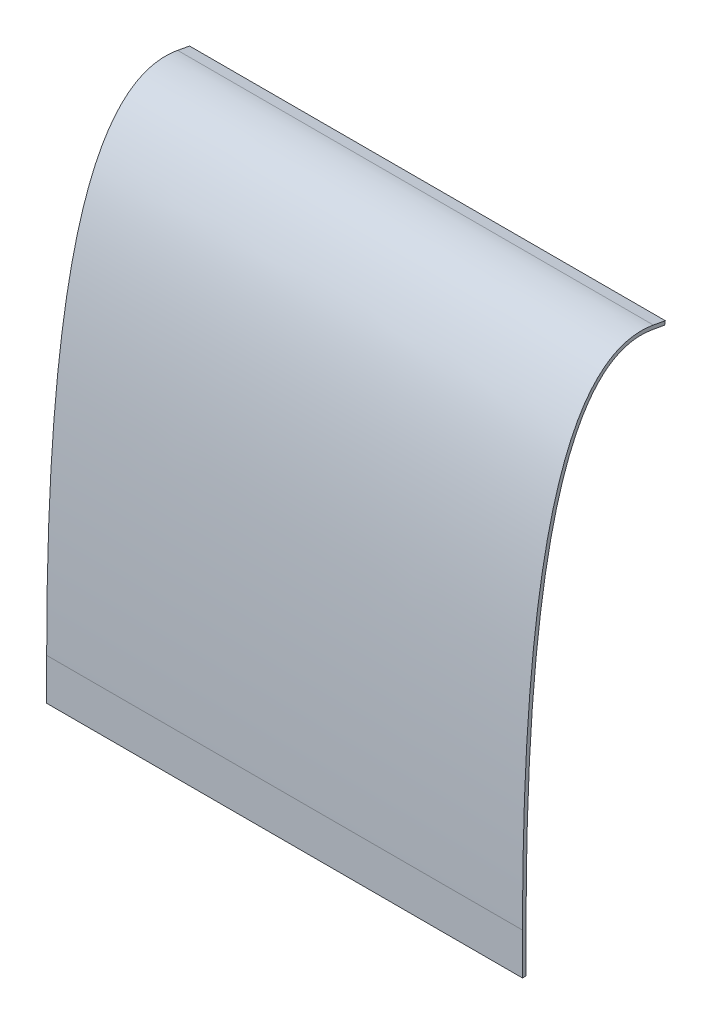
ISO-10303-21;
HEADER;
FILE_DESCRIPTION(('STEP AP214'),'2;1');
FILE_NAME('part.step','',(''),(''),'','','');
FILE_SCHEMA(('AUTOMOTIVE_DESIGN { 1 0 10303 214 1 1 1 1 }'));
ENDSEC;
DATA;
#1=APPLICATION_CONTEXT('core data for automotive mechanical design processes');
#2=APPLICATION_PROTOCOL_DEFINITION('international standard','automotive_design',2000,#1);
#3=PRODUCT_CONTEXT('',#1,'mechanical');
#4=PRODUCT('Part','Part','',(#3));
#5=PRODUCT_RELATED_PRODUCT_CATEGORY('part','',(#4));
#6=PRODUCT_DEFINITION_FORMATION('','',#4);
#7=PRODUCT_DEFINITION_CONTEXT('part definition',#1,'design');
#8=PRODUCT_DEFINITION('design','',#6,#7);
#9=PRODUCT_DEFINITION_SHAPE('','',#8);
#10=(LENGTH_UNIT() NAMED_UNIT(*) SI_UNIT(.MILLI.,.METRE.));
#11=(NAMED_UNIT(*) PLANE_ANGLE_UNIT() SI_UNIT($,.RADIAN.));
#12=(NAMED_UNIT(*) SI_UNIT($,.STERADIAN.) SOLID_ANGLE_UNIT());
#13=UNCERTAINTY_MEASURE_WITH_UNIT(LENGTH_MEASURE(1.E-05),#10,'distance_accuracy_value','');
#14=(GEOMETRIC_REPRESENTATION_CONTEXT(3) GLOBAL_UNCERTAINTY_ASSIGNED_CONTEXT((#13)) GLOBAL_UNIT_ASSIGNED_CONTEXT((#10,
#11,#12)) REPRESENTATION_CONTEXT('',''));
#15=CARTESIAN_POINT('',(0.,0.,0.));
#16=DIRECTION('',(0.,0.,1.));
#17=DIRECTION('',(1.,0.,0.));
#18=AXIS2_PLACEMENT_3D('',#15,#16,#17);
#19=CARTESIAN_POINT('',(0.,-5374.65375184319,3.175));
#20=DIRECTION('',(1.,0.,0.));
#21=DIRECTION('',(0.,1.,0.));
#22=AXIS2_PLACEMENT_3D('',#19,#20,#21);
#23=PLANE('',#22);
#24=DIRECTION('',(0.,-1.,0.));
#25=VECTOR('',#24,1.);
#26=CARTESIAN_POINT('',(0.,-5374.65375184319,0.));
#27=LINE('',#26,#25);
#28=CARTESIAN_POINT('',(0.,-5338.16883094508,-1.55431223447522E-12));
#29=VERTEX_POINT('',#28);
#30=CARTESIAN_POINT('',(0.,-5374.65375184319,0.));
#31=VERTEX_POINT('',#30);
#32=EDGE_CURVE('E95',#29,#31,#27,.T.);
#33=ORIENTED_EDGE('',*,*,#32,.T.);
#34=DIRECTION('',(0.,0.,-1.));
#35=VECTOR('',#34,1.);
#36=CARTESIAN_POINT('',(0.,-5374.65375184319,3.175));
#37=LINE('',#36,#35);
#38=CARTESIAN_POINT('',(0.,-5374.65375184319,3.175));
#39=VERTEX_POINT('',#38);
#40=EDGE_CURVE('E11',#39,#31,#37,.T.);
#41=ORIENTED_EDGE('',*,*,#40,.F.);
#42=DIRECTION('',(0.,-1.,0.));
#43=VECTOR('',#42,1.);
#44=CARTESIAN_POINT('',(0.,-5374.65375184319,3.175));
#45=LINE('',#44,#43);
#46=CARTESIAN_POINT('',(0.,-5338.16883094508,3.175));
#47=VERTEX_POINT('',#46);
#48=EDGE_CURVE('E88',#47,#39,#45,.T.);
#49=ORIENTED_EDGE('',*,*,#48,.F.);
#50=CARTESIAN_POINT('',(0.,-5338.16883094512,3.17499999999692));
#51=CARTESIAN_POINT('',(0.,-5335.98734076766,3.17499999999698));
#52=CARTESIAN_POINT('',(0.,-5331.61137520197,3.17046541118602));
#53=CARTESIAN_POINT('',(0.,-5322.96335403535,3.14325696179797));
#54=CARTESIAN_POINT('',(0.,-5312.27638574883,3.07523348434504));
#55=CARTESIAN_POINT('',(0.,-5299.67140732244,2.93917848604421));
#56=CARTESIAN_POINT('',(0.,-5283.14925353704,2.68519354127753));
#57=CARTESIAN_POINT('',(0.,-5263.03358789846,2.23160969949004));
#58=CARTESIAN_POINT('',(0.,-5239.75265206165,1.46947489329059));
#59=CARTESIAN_POINT('',(0.,-5217.32963310155,0.489420194701327));
#60=CARTESIAN_POINT('',(0.,-5188.57565879304,-1.10802295379985));
#61=CARTESIAN_POINT('',(0.,-5154.77627524637,-3.65020946173063));
#62=CARTESIAN_POINT('',(0.,-5117.64263301676,-7.57487259671049));
#63=CARTESIAN_POINT('',(0.,-5083.93016515085,-12.3759483752846));
#64=CARTESIAN_POINT('',(0.,-5053.63287456938,-18.0569483816005));
#65=CARTESIAN_POINT('',(0.,-5017.77931089873,-26.8143362972912));
#66=CARTESIAN_POINT('',(0.,-4988.71861289562,-37.3605308212314));
#67=CARTESIAN_POINT('',(0.,-4966.39885120448,-49.7957669766878));
#68=CARTESIAN_POINT('',(0.,-4953.02734383279,-60.1213480910946));
#69=CARTESIAN_POINT('',(0.,-4943.05871353346,-71.5130112879739));
#70=CARTESIAN_POINT('',(0.,-4937.68084608282,-81.9236706532682));
#71=CARTESIAN_POINT('',(0.,-4935.2065623479,-90.7533778061448));
#72=CARTESIAN_POINT('',(0.,-4934.27161001883,-97.5979563520677));
#73=CARTESIAN_POINT('',(0.,-4934.25945037581,-103.474595101765));
#74=CARTESIAN_POINT('',(0.,-4934.70154226411,-108.253920150425));
#75=CARTESIAN_POINT('',(0.,-4935.07716391724,-110.696774930857));
#76=CARTESIAN_POINT('',(0.,-4935.29808523912,-111.902729484426));
#77=B_SPLINE_CURVE_WITH_KNOTS('',3,(#50,#51,#52,#53,#54,#55,#56,#57,#58,#59,#60,#61,#62,#63,#64,
#65,#66,#67,#68,#69,#70,#71,#72,#73,#74,#75,#76),.UNSPECIFIED.,.F.,.F.,(4,1,1,1,1,1,1,1,1,1,1,1,
1,1,1,1,1,1,1,1,1,1,1,1,4),(0.490445446996944,0.490528714033792,0.490611981070641,
0.490778515144339,0.490945049218036,0.491111583291734,0.491444651439129,0.491777719586524,
0.492110787733919,0.492443855881315,0.493109992176105,0.493776128470895,0.494442264765686,
0.495108401060476,0.495774537355266,0.497106809944847,0.497772946239638,0.498439082534428,
0.499105218829218,0.499771355124009,0.500104423271404,0.500437491418799,0.500770559566194,
0.500937093639892,0.501103627713589),.UNSPECIFIED.);
#78=CARTESIAN_POINT('',(0.,-4935.29808523912,-111.902729484426));
#79=VERTEX_POINT('',#78);
#80=EDGE_CURVE('E49',#47,#79,#77,.T.);
#81=ORIENTED_EDGE('',*,*,#80,.T.);
#82=DIRECTION('',(0.,-0.180193443168995,-0.983631192591462));
#83=VECTOR('',#82,1.);
#84=CARTESIAN_POINT('',(0.,-4935.29808523912,-111.902729484426));
#85=LINE('',#84,#83);
#86=CARTESIAN_POINT('',(0.,-4937.21565146267,-122.370246604773));
#87=VERTEX_POINT('',#86);
#88=EDGE_CURVE('E143',#79,#87,#85,.T.);
#89=ORIENTED_EDGE('',*,*,#88,.T.);
#90=DIRECTION('',(0.,-0.983631192592149,0.180193443165247));
#91=VECTOR('',#90,1.);
#92=CARTESIAN_POINT('',(0.,-4940.33868049915,-121.798132422724));
#93=LINE('',#92,#91);
#94=CARTESIAN_POINT('',(0.,-4940.33868049915,-121.798132422724));
#95=VERTEX_POINT('',#94);
#96=EDGE_CURVE('E134',#87,#95,#93,.T.);
#97=ORIENTED_EDGE('',*,*,#96,.T.);
#98=DIRECTION('',(0.,0.180193443165249,0.983631192592148));
#99=VECTOR('',#98,1.);
#100=CARTESIAN_POINT('',(0.,-4938.42111427564,-111.33061530237));
#101=LINE('',#100,#99);
#102=CARTESIAN_POINT('',(0.,-4938.42111427564,-111.33061530237));
#103=VERTEX_POINT('',#102);
#104=EDGE_CURVE('E126',#95,#103,#101,.T.);
#105=ORIENTED_EDGE('',*,*,#104,.T.);
#106=CARTESIAN_POINT('',(0.,-972092.39667576,-254466.035004709));
#107=CARTESIAN_POINT('',(0.,964580.96794132,244923.154052706));
#108=CARTESIAN_POINT('',(0.,-976825.222864024,-235738.14631102));
#109=B_SPLINE_CURVE_WITH_KNOTS('',2,(#106,#107,#108),.UNSPECIFIED.,.F.,.F.,(3,3),(0.,1.),.UNSPECIFIED.);
#110=EDGE_CURVE('E70',#103,#29,#109,.T.);
#111=ORIENTED_EDGE('',*,*,#110,.T.);
#112=EDGE_LOOP('',(#33,#41,#49,#81,#89,#97,#105,#111));
#113=FACE_BOUND('',#112,.T.);
#114=ADVANCED_FACE('F33',(#113),#23,.F.);
#115=CARTESIAN_POINT('',(0.,-5374.65375184319,3.175));
#116=DIRECTION('',(0.,1.,0.));
#117=DIRECTION('',(0.,0.,1.));
#118=AXIS2_PLACEMENT_3D('',#115,#116,#117);
#119=PLANE('',#118);
#120=DIRECTION('',(1.,0.,0.));
#121=VECTOR('',#120,1.);
#122=CARTESIAN_POINT('',(0.,-5374.65375184319,0.));
#123=LINE('',#122,#121);
#124=CARTESIAN_POINT('',(418.07892,-5374.65375184319,0.));
#125=VERTEX_POINT('',#124);
#126=EDGE_CURVE('E62',#31,#125,#123,.T.);
#127=ORIENTED_EDGE('',*,*,#126,.T.);
#128=DIRECTION('',(0.,0.,-1.));
#129=VECTOR('',#128,1.);
#130=CARTESIAN_POINT('',(418.07892,-5374.65375184319,3.175));
#131=LINE('',#130,#129);
#132=CARTESIAN_POINT('',(418.07892,-5374.65375184319,3.175));
#133=VERTEX_POINT('',#132);
#134=EDGE_CURVE('E41',#133,#125,#131,.T.);
#135=ORIENTED_EDGE('',*,*,#134,.F.);
#136=DIRECTION('',(1.,0.,0.));
#137=VECTOR('',#136,1.);
#138=CARTESIAN_POINT('',(0.,-5374.65375184319,3.175));
#139=LINE('',#138,#137);
#140=EDGE_CURVE('E79',#39,#133,#139,.T.);
#141=ORIENTED_EDGE('',*,*,#140,.F.);
#142=ORIENTED_EDGE('',*,*,#40,.T.);
#143=EDGE_LOOP('',(#127,#135,#141,#142));
#144=FACE_BOUND('',#143,.T.);
#145=ADVANCED_FACE('F81',(#144),#119,.F.);
#146=CARTESIAN_POINT('',(418.07892,-5374.65375184319,3.175));
#147=DIRECTION('',(-1.,0.,0.));
#148=DIRECTION('',(0.,0.,1.));
#149=AXIS2_PLACEMENT_3D('',#146,#147,#148);
#150=PLANE('',#149);
#151=DIRECTION('',(0.,1.,0.));
#152=VECTOR('',#151,1.);
#153=CARTESIAN_POINT('',(418.07892,-5374.65375184319,0.));
#154=LINE('',#153,#152);
#155=CARTESIAN_POINT('',(418.07892,-5338.16883094508,-1.55431223447522E-12));
#156=VERTEX_POINT('',#155);
#157=EDGE_CURVE('E98',#125,#156,#154,.T.);
#158=ORIENTED_EDGE('',*,*,#157,.T.);
#159=CARTESIAN_POINT('',(418.07892,-972092.39667576,-254466.035004709));
#160=CARTESIAN_POINT('',(418.07892,964580.96794132,244923.154052706));
#161=CARTESIAN_POINT('',(418.07892,-976825.222864024,-235738.14631102));
#162=B_SPLINE_CURVE_WITH_KNOTS('',2,(#159,#160,#161),.UNSPECIFIED.,.F.,.F.,(3,3),(0.,1.),.UNSPECIFIED.);
#163=CARTESIAN_POINT('',(418.07892,-4938.42111427564,-111.33061530237));
#164=VERTEX_POINT('',#163);
#165=EDGE_CURVE('E112',#164,#156,#162,.T.);
#166=ORIENTED_EDGE('',*,*,#165,.F.);
#167=DIRECTION('',(0.,0.180193443165249,0.983631192592148));
#168=VECTOR('',#167,1.);
#169=CARTESIAN_POINT('',(418.07892,-4938.42111427564,-111.33061530237));
#170=LINE('',#169,#168);
#171=CARTESIAN_POINT('',(418.07892,-4940.33868049915,-121.798132422724));
#172=VERTEX_POINT('',#171);
#173=EDGE_CURVE('E120',#172,#164,#170,.T.);
#174=ORIENTED_EDGE('',*,*,#173,.F.);
#175=DIRECTION('',(0.,-0.983631192592149,0.180193443165247));
#176=VECTOR('',#175,1.);
#177=CARTESIAN_POINT('',(418.07892,-4940.33868049915,-121.798132422724));
#178=LINE('',#177,#176);
#179=CARTESIAN_POINT('',(418.07892,-4937.21565146267,-122.370246604773));
#180=VERTEX_POINT('',#179);
#181=EDGE_CURVE('E131',#180,#172,#178,.T.);
#182=ORIENTED_EDGE('',*,*,#181,.F.);
#183=DIRECTION('',(0.,-0.180193443168995,-0.983631192591462));
#184=VECTOR('',#183,1.);
#185=CARTESIAN_POINT('',(418.07892,-4935.29808523912,-111.902729484426));
#186=LINE('',#185,#184);
#187=CARTESIAN_POINT('',(418.07892,-4935.29808523912,-111.902729484426));
#188=VERTEX_POINT('',#187);
#189=EDGE_CURVE('E140',#188,#180,#186,.T.);
#190=ORIENTED_EDGE('',*,*,#189,.F.);
#191=CARTESIAN_POINT('',(418.07892,-5338.16883094512,3.17499999999692));
#192=CARTESIAN_POINT('',(418.07892,-5335.98734076766,3.17499999999698));
#193=CARTESIAN_POINT('',(418.07892,-5331.61137520197,3.17046541118602));
#194=CARTESIAN_POINT('',(418.07892,-5322.96335403535,3.14325696179797));
#195=CARTESIAN_POINT('',(418.07892,-5312.27638574883,3.07523348434504));
#196=CARTESIAN_POINT('',(418.07892,-5299.67140732244,2.93917848604421));
#197=CARTESIAN_POINT('',(418.07892,-5283.14925353704,2.68519354127753));
#198=CARTESIAN_POINT('',(418.07892,-5263.03358789846,2.23160969949004));
#199=CARTESIAN_POINT('',(418.07892,-5239.75265206165,1.46947489329059));
#200=CARTESIAN_POINT('',(418.07892,-5217.32963310155,0.489420194701327));
#201=CARTESIAN_POINT('',(418.07892,-5188.57565879304,-1.10802295379985));
#202=CARTESIAN_POINT('',(418.07892,-5154.77627524637,-3.65020946173063));
#203=CARTESIAN_POINT('',(418.07892,-5117.64263301676,-7.57487259671049));
#204=CARTESIAN_POINT('',(418.07892,-5083.93016515085,-12.3759483752846));
#205=CARTESIAN_POINT('',(418.07892,-5053.63287456938,-18.0569483816005));
#206=CARTESIAN_POINT('',(418.07892,-5017.77931089873,-26.8143362972912));
#207=CARTESIAN_POINT('',(418.07892,-4988.71861289562,-37.3605308212314));
#208=CARTESIAN_POINT('',(418.07892,-4966.39885120448,-49.7957669766878));
#209=CARTESIAN_POINT('',(418.07892,-4953.02734383279,-60.1213480910946));
#210=CARTESIAN_POINT('',(418.07892,-4943.05871353346,-71.5130112879739));
#211=CARTESIAN_POINT('',(418.07892,-4937.68084608282,-81.9236706532682));
#212=CARTESIAN_POINT('',(418.07892,-4935.2065623479,-90.7533778061448));
#213=CARTESIAN_POINT('',(418.07892,-4934.27161001883,-97.5979563520677));
#214=CARTESIAN_POINT('',(418.07892,-4934.25945037581,-103.474595101765));
#215=CARTESIAN_POINT('',(418.07892,-4934.70154226411,-108.253920150425));
#216=CARTESIAN_POINT('',(418.07892,-4935.07716391724,-110.696774930857));
#217=CARTESIAN_POINT('',(418.07892,-4935.29808523912,-111.902729484426));
#218=B_SPLINE_CURVE_WITH_KNOTS('',3,(#191,#192,#193,#194,#195,#196,#197,#198,#199,#200,#201,
#202,#203,#204,#205,#206,#207,#208,#209,#210,#211,#212,#213,#214,#215,#216,#217),.UNSPECIFIED.,
.F.,.F.,(4,1,1,1,1,1,1,1,1,1,1,1,1,1,1,1,1,1,1,1,1,1,1,1,4),(0.490445446996944,
0.490528714033792,0.490611981070641,0.490778515144339,0.490945049218036,0.491111583291734,
0.491444651439129,0.491777719586524,0.492110787733919,0.492443855881315,0.493109992176105,
0.493776128470895,0.494442264765686,0.495108401060476,0.495774537355266,0.497106809944847,
0.497772946239638,0.498439082534428,0.499105218829218,0.499771355124009,0.500104423271404,
0.500437491418799,0.500770559566194,0.500937093639892,0.501103627713589),.UNSPECIFIED.);
#219=CARTESIAN_POINT('',(418.07892,-5338.16883094512,3.17499999999692));
#220=VERTEX_POINT('',#219);
#221=EDGE_CURVE('E149',#220,#188,#218,.T.);
#222=ORIENTED_EDGE('',*,*,#221,.F.);
#223=DIRECTION('',(0.,1.,0.));
#224=VECTOR('',#223,1.);
#225=CARTESIAN_POINT('',(418.07892,-5374.65375184319,3.175));
#226=LINE('',#225,#224);
#227=EDGE_CURVE('E87',#133,#220,#226,.T.);
#228=ORIENTED_EDGE('',*,*,#227,.F.);
#229=ORIENTED_EDGE('',*,*,#134,.T.);
#230=EDGE_LOOP('',(#158,#166,#174,#182,#190,#222,#228,#229));
#231=FACE_BOUND('',#230,.T.);
#232=ADVANCED_FACE('F196',(#231),#150,.F.);
#233=CARTESIAN_POINT('',(0.,0.,3.175));
#234=DIRECTION('',(0.,0.,-1.));
#235=DIRECTION('',(-1.,0.,0.));
#236=AXIS2_PLACEMENT_3D('',#233,#234,#235);
#237=PLANE('',#236);
#238=ORIENTED_EDGE('',*,*,#48,.T.);
#239=ORIENTED_EDGE('',*,*,#140,.T.);
#240=ORIENTED_EDGE('',*,*,#227,.T.);
#241=DIRECTION('',(-1.,0.,0.));
#242=VECTOR('',#241,1.);
#243=CARTESIAN_POINT('',(0.,-5338.16883094508,3.175));
#244=LINE('',#243,#242);
#245=EDGE_CURVE('E92',#220,#47,#244,.T.);
#246=ORIENTED_EDGE('',*,*,#245,.T.);
#247=EDGE_LOOP('',(#238,#239,#240,#246));
#248=FACE_BOUND('',#247,.T.);
#249=ADVANCED_FACE('F91',(#248),#237,.F.);
#250=CARTESIAN_POINT('',(0.,0.,0.));
#251=DIRECTION('',(0.,0.,-1.));
#252=DIRECTION('',(-1.,0.,0.));
#253=AXIS2_PLACEMENT_3D('',#250,#251,#252);
#254=PLANE('',#253);
#255=ORIENTED_EDGE('',*,*,#32,.F.);
#256=DIRECTION('',(-1.,0.,0.));
#257=VECTOR('',#256,1.);
#258=CARTESIAN_POINT('',(0.,-5338.16883094508,0.));
#259=LINE('',#258,#257);
#260=EDGE_CURVE('E93',#156,#29,#259,.T.);
#261=ORIENTED_EDGE('',*,*,#260,.F.);
#262=ORIENTED_EDGE('',*,*,#157,.F.);
#263=ORIENTED_EDGE('',*,*,#126,.F.);
#264=EDGE_LOOP('',(#255,#261,#262,#263));
#265=FACE_BOUND('',#264,.T.);
#266=ADVANCED_FACE('F203',(#265),#254,.T.);
#267=CARTESIAN_POINT('',(418.07892,-5338.16883094512,3.17499999999692));
#268=CARTESIAN_POINT('',(0.,-5338.16883094512,3.17499999999692));
#269=CARTESIAN_POINT('',(418.07892,-5335.98734076766,3.17499999999698));
#270=CARTESIAN_POINT('',(0.,-5335.98734076766,3.17499999999698));
#271=CARTESIAN_POINT('',(418.07892,-5331.61137520197,3.17046541118602));
#272=CARTESIAN_POINT('',(0.,-5331.61137520197,3.17046541118602));
#273=CARTESIAN_POINT('',(418.07892,-5322.96335403535,3.14325696179797));
#274=CARTESIAN_POINT('',(0.,-5322.96335403535,3.14325696179797));
#275=CARTESIAN_POINT('',(418.07892,-5312.27638574883,3.07523348434504));
#276=CARTESIAN_POINT('',(0.,-5312.27638574883,3.07523348434504));
#277=CARTESIAN_POINT('',(418.07892,-5299.67140732244,2.93917848604421));
#278=CARTESIAN_POINT('',(0.,-5299.67140732244,2.93917848604421));
#279=CARTESIAN_POINT('',(418.07892,-5283.14925353704,2.68519354127753));
#280=CARTESIAN_POINT('',(0.,-5283.14925353704,2.68519354127753));
#281=CARTESIAN_POINT('',(418.07892,-5263.03358789846,2.23160969949004));
#282=CARTESIAN_POINT('',(0.,-5263.03358789846,2.23160969949004));
#283=CARTESIAN_POINT('',(418.07892,-5239.75265206165,1.46947489329059));
#284=CARTESIAN_POINT('',(0.,-5239.75265206165,1.46947489329059));
#285=CARTESIAN_POINT('',(418.07892,-5217.32963310155,0.489420194701327));
#286=CARTESIAN_POINT('',(0.,-5217.32963310155,0.489420194701327));
#287=CARTESIAN_POINT('',(418.07892,-5188.57565879304,-1.10802295379985));
#288=CARTESIAN_POINT('',(0.,-5188.57565879304,-1.10802295379985));
#289=CARTESIAN_POINT('',(418.07892,-5154.77627524637,-3.65020946173063));
#290=CARTESIAN_POINT('',(0.,-5154.77627524637,-3.65020946173063));
#291=CARTESIAN_POINT('',(418.07892,-5117.64263301676,-7.57487259671049));
#292=CARTESIAN_POINT('',(0.,-5117.64263301676,-7.57487259671049));
#293=CARTESIAN_POINT('',(418.07892,-5083.93016515085,-12.3759483752846));
#294=CARTESIAN_POINT('',(0.,-5083.93016515085,-12.3759483752846));
#295=CARTESIAN_POINT('',(418.07892,-5053.63287456938,-18.0569483816005));
#296=CARTESIAN_POINT('',(0.,-5053.63287456938,-18.0569483816005));
#297=CARTESIAN_POINT('',(418.07892,-5017.77931089873,-26.8143362972912));
#298=CARTESIAN_POINT('',(0.,-5017.77931089873,-26.8143362972912));
#299=CARTESIAN_POINT('',(418.07892,-4988.71861289562,-37.3605308212314));
#300=CARTESIAN_POINT('',(0.,-4988.71861289562,-37.3605308212314));
#301=CARTESIAN_POINT('',(418.07892,-4966.39885120448,-49.7957669766878));
#302=CARTESIAN_POINT('',(0.,-4966.39885120448,-49.7957669766878));
#303=CARTESIAN_POINT('',(418.07892,-4953.02734383279,-60.1213480910946));
#304=CARTESIAN_POINT('',(0.,-4953.02734383279,-60.1213480910946));
#305=CARTESIAN_POINT('',(418.07892,-4943.05871353346,-71.5130112879739));
#306=CARTESIAN_POINT('',(0.,-4943.05871353346,-71.5130112879739));
#307=CARTESIAN_POINT('',(418.07892,-4937.68084608282,-81.9236706532682));
#308=CARTESIAN_POINT('',(0.,-4937.68084608282,-81.9236706532682));
#309=CARTESIAN_POINT('',(418.07892,-4935.2065623479,-90.7533778061448));
#310=CARTESIAN_POINT('',(0.,-4935.2065623479,-90.7533778061448));
#311=CARTESIAN_POINT('',(418.07892,-4934.27161001883,-97.5979563520677));
#312=CARTESIAN_POINT('',(0.,-4934.27161001883,-97.5979563520677));
#313=CARTESIAN_POINT('',(418.07892,-4934.25945037581,-103.474595101765));
#314=CARTESIAN_POINT('',(0.,-4934.25945037581,-103.474595101765));
#315=CARTESIAN_POINT('',(418.07892,-4934.70154226411,-108.253920150425));
#316=CARTESIAN_POINT('',(0.,-4934.70154226411,-108.253920150425));
#317=CARTESIAN_POINT('',(418.07892,-4935.07716391724,-110.696774930857));
#318=CARTESIAN_POINT('',(0.,-4935.07716391724,-110.696774930857));
#319=CARTESIAN_POINT('',(418.07892,-4935.29808523912,-111.902729484426));
#320=CARTESIAN_POINT('',(0.,-4935.29808523912,-111.902729484426));
#321=B_SPLINE_SURFACE_WITH_KNOTS('',3,1,((#267,#268),(#269,#270),(#271,#272),(#273,#274),(#275,
#276),(#277,#278),(#279,#280),(#281,#282),(#283,#284),(#285,#286),(#287,#288),(#289,#290),(#291,
#292),(#293,#294),(#295,#296),(#297,#298),(#299,#300),(#301,#302),(#303,#304),(#305,#306),(#307,
#308),(#309,#310),(#311,#312),(#313,#314),(#315,#316),(#317,#318),(#319,#320)),.UNSPECIFIED.,
.F.,.F.,.F.,(4,1,1,1,1,1,1,1,1,1,1,1,1,1,1,1,1,1,1,1,1,1,1,1,4),(2,2),(0.,0.00781250000000041,
0.0156250000000008,0.0312500000000016,0.0468750000000024,0.0625000000000033,0.0937500000000049,
0.125000000000001,0.156249999999998,0.187499999999999,0.250000000000003,0.312500000000001,
0.374999999999999,0.437500000000002,0.5,0.625000000000001,0.687499999999999,0.749999999999997,
0.812500000000001,0.874999999999999,0.906249999999995,0.937499999999997,0.968749999999998,
0.984374999999999,1.),(0.,1.),.UNSPECIFIED.);
#322=DIRECTION('',(-1.,0.,0.));
#323=VECTOR('',#322,1.);
#324=CARTESIAN_POINT('',(418.07892,-4935.29808523912,-111.902729484426));
#325=LINE('',#324,#323);
#326=EDGE_CURVE('E146',#188,#79,#325,.T.);
#327=ORIENTED_EDGE('',*,*,#326,.T.);
#328=ORIENTED_EDGE('',*,*,#80,.F.);
#329=ORIENTED_EDGE('',*,*,#245,.F.);
#330=ORIENTED_EDGE('',*,*,#221,.T.);
#331=EDGE_LOOP('',(#327,#328,#329,#330));
#332=FACE_BOUND('',#331,.T.);
#333=ADVANCED_FACE('F166',(#332),#321,.T.);
#334=CARTESIAN_POINT('',(418.07892,-4935.29808523912,-111.902729484426));
#335=DIRECTION('',(0.,0.983631192591462,-0.180193443168995));
#336=DIRECTION('',(0.,0.180193443168995,0.983631192591462));
#337=AXIS2_PLACEMENT_3D('',#334,#335,#336);
#338=PLANE('',#337);
#339=DIRECTION('',(-1.,0.,0.));
#340=VECTOR('',#339,1.);
#341=CARTESIAN_POINT('',(418.07892,-4937.21565146267,-122.370246604773));
#342=LINE('',#341,#340);
#343=EDGE_CURVE('E137',#180,#87,#342,.T.);
#344=ORIENTED_EDGE('',*,*,#343,.T.);
#345=ORIENTED_EDGE('',*,*,#88,.F.);
#346=ORIENTED_EDGE('',*,*,#326,.F.);
#347=ORIENTED_EDGE('',*,*,#189,.T.);
#348=EDGE_LOOP('',(#344,#345,#346,#347));
#349=FACE_BOUND('',#348,.T.);
#350=ADVANCED_FACE('F173',(#349),#338,.T.);
#351=CARTESIAN_POINT('',(418.07892,-4940.33868049915,-121.798132422724));
#352=DIRECTION('',(0.,-0.180193443165247,-0.983631192592149));
#353=DIRECTION('',(0.,0.983631192592149,-0.180193443165247));
#354=AXIS2_PLACEMENT_3D('',#351,#352,#353);
#355=PLANE('',#354);
#356=DIRECTION('',(-1.,0.,0.));
#357=VECTOR('',#356,1.);
#358=CARTESIAN_POINT('',(418.07892,-4940.33868049915,-121.798132422724));
#359=LINE('',#358,#357);
#360=EDGE_CURVE('E128',#172,#95,#359,.T.);
#361=ORIENTED_EDGE('',*,*,#360,.T.);
#362=ORIENTED_EDGE('',*,*,#96,.F.);
#363=ORIENTED_EDGE('',*,*,#343,.F.);
#364=ORIENTED_EDGE('',*,*,#181,.T.);
#365=EDGE_LOOP('',(#361,#362,#363,#364));
#366=FACE_BOUND('',#365,.T.);
#367=ADVANCED_FACE('F181',(#366),#355,.T.);
#368=CARTESIAN_POINT('',(418.07892,-4938.42111427564,-111.33061530237));
#369=DIRECTION('',(0.,-0.983631192592148,0.180193443165249));
#370=DIRECTION('',(0.,-0.180193443165249,-0.983631192592148));
#371=AXIS2_PLACEMENT_3D('',#368,#369,#370);
#372=PLANE('',#371);
#373=DIRECTION('',(-1.,0.,0.));
#374=VECTOR('',#373,1.);
#375=CARTESIAN_POINT('',(418.07892,-4938.42111427564,-111.33061530237));
#376=LINE('',#375,#374);
#377=EDGE_CURVE('E100',#164,#103,#376,.T.);
#378=ORIENTED_EDGE('',*,*,#377,.T.);
#379=ORIENTED_EDGE('',*,*,#104,.F.);
#380=ORIENTED_EDGE('',*,*,#360,.F.);
#381=ORIENTED_EDGE('',*,*,#173,.T.);
#382=EDGE_LOOP('',(#378,#379,#380,#381));
#383=FACE_BOUND('',#382,.T.);
#384=ADVANCED_FACE('F187',(#383),#372,.T.);
#385=CARTESIAN_POINT('',(418.07892,-4938.4211142756,-111.330615302373));
#386=CARTESIAN_POINT('',(0.,-4938.4211142756,-111.330615302373));
#387=CARTESIAN_POINT('',(418.07892,-4918.02622739916,5.45397060847108E-12));
#388=CARTESIAN_POINT('',(0.,-4918.02622739916,5.45397060847108E-12));
#389=CARTESIAN_POINT('',(418.07892,-5338.16883094508,-1.08498400913381E-12));
#390=CARTESIAN_POINT('',(0.,-5338.16883094508,-1.08498400913381E-12));
#391=B_SPLINE_SURFACE_WITH_KNOTS('',2,1,((#385,#386),(#387,#388),(#389,#390)),.UNSPECIFIED.,.F.,
.F.,.F.,(3,3),(2,2),(0.,1.),(0.,1.),.UNSPECIFIED.);
#392=ORIENTED_EDGE('',*,*,#260,.T.);
#393=ORIENTED_EDGE('',*,*,#110,.F.);
#394=ORIENTED_EDGE('',*,*,#377,.F.);
#395=ORIENTED_EDGE('',*,*,#165,.T.);
#396=EDGE_LOOP('',(#392,#393,#394,#395));
#397=FACE_BOUND('',#396,.T.);
#398=ADVANCED_FACE('F237',(#397),#391,.T.);
#399=CLOSED_SHELL('',(#114,#145,#232,#249,#266,#333,#350,#367,#384,#398));
#400=MANIFOLD_SOLID_BREP('B2',#399);
#401=ADVANCED_BREP_SHAPE_REPRESENTATION('',(#18,#400),#14);
#402=SHAPE_DEFINITION_REPRESENTATION(#9,#401);
ENDSEC;
END-ISO-10303-21;
